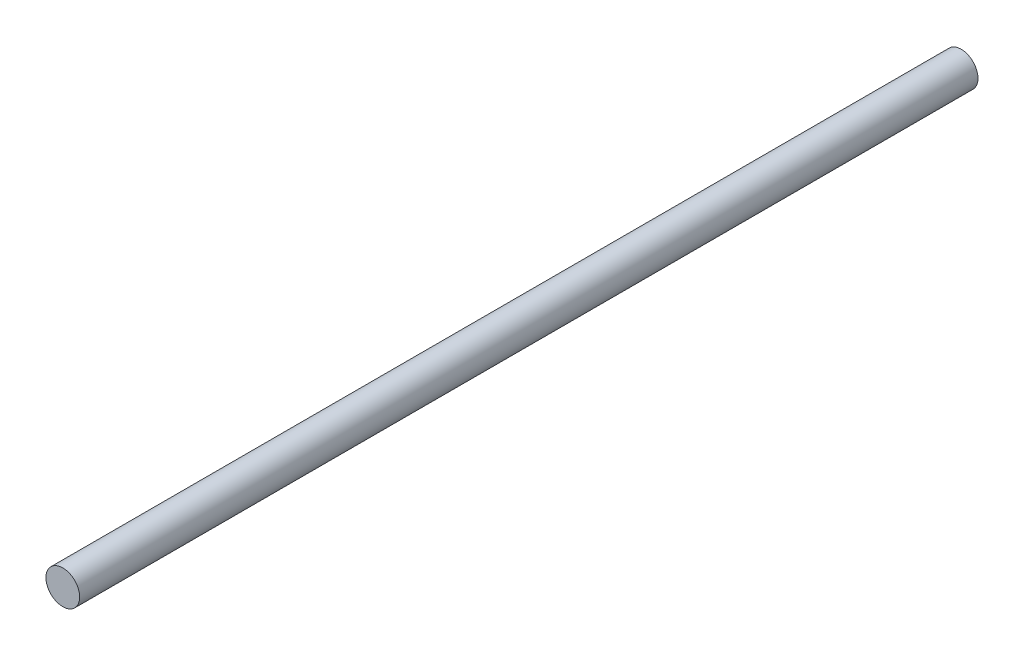
ISO-10303-21;
HEADER;
FILE_DESCRIPTION(('STEP AP214'),'2;1');
FILE_NAME('part.step','',(''),(''),'','','');
FILE_SCHEMA(('AUTOMOTIVE_DESIGN { 1 0 10303 214 1 1 1 1 }'));
ENDSEC;
DATA;
#1=APPLICATION_CONTEXT('core data for automotive mechanical design processes');
#2=APPLICATION_PROTOCOL_DEFINITION('international standard','automotive_design',2000,#1);
#3=PRODUCT_CONTEXT('',#1,'mechanical');
#4=PRODUCT('Part','Part','',(#3));
#5=PRODUCT_RELATED_PRODUCT_CATEGORY('part','',(#4));
#6=PRODUCT_DEFINITION_FORMATION('','',#4);
#7=PRODUCT_DEFINITION_CONTEXT('part definition',#1,'design');
#8=PRODUCT_DEFINITION('design','',#6,#7);
#9=PRODUCT_DEFINITION_SHAPE('','',#8);
#10=(LENGTH_UNIT() NAMED_UNIT(*) SI_UNIT(.MILLI.,.METRE.));
#11=(NAMED_UNIT(*) PLANE_ANGLE_UNIT() SI_UNIT($,.RADIAN.));
#12=(NAMED_UNIT(*) SI_UNIT($,.STERADIAN.) SOLID_ANGLE_UNIT());
#13=UNCERTAINTY_MEASURE_WITH_UNIT(LENGTH_MEASURE(1.E-05),#10,'distance_accuracy_value','');
#14=(GEOMETRIC_REPRESENTATION_CONTEXT(3) GLOBAL_UNCERTAINTY_ASSIGNED_CONTEXT((#13)) GLOBAL_UNIT_ASSIGNED_CONTEXT((#10,
#11,#12)) REPRESENTATION_CONTEXT('',''));
#15=CARTESIAN_POINT('',(0.,0.,0.));
#16=DIRECTION('',(0.,0.,1.));
#17=DIRECTION('',(1.,0.,0.));
#18=AXIS2_PLACEMENT_3D('',#15,#16,#17);
#19=CARTESIAN_POINT('',(0.,0.,400.));
#20=DIRECTION('',(0.,0.,-1.));
#21=DIRECTION('',(-1.,0.,0.));
#22=AXIS2_PLACEMENT_3D('',#19,#20,#21);
#23=CYLINDRICAL_SURFACE('',#22,7.50000000000001);
#24=CARTESIAN_POINT('',(0.,0.,400.));
#25=DIRECTION('',(0.,0.,1.));
#26=DIRECTION('',(1.,0.,0.));
#27=AXIS2_PLACEMENT_3D('',#24,#25,#26);
#28=CIRCLE('',#27,7.50000000000001);
#29=CARTESIAN_POINT('',(7.50000000000001,0.,400.));
#30=VERTEX_POINT('',#29);
#31=EDGE_CURVE('E10',#30,#30,#28,.T.);
#32=ORIENTED_EDGE('',*,*,#31,.F.);
#33=EDGE_LOOP('',(#32));
#34=FACE_BOUND('',#33,.T.);
#35=CARTESIAN_POINT('',(0.,0.,0.));
#36=DIRECTION('',(0.,0.,1.));
#37=DIRECTION('',(1.,0.,0.));
#38=AXIS2_PLACEMENT_3D('',#35,#36,#37);
#39=CIRCLE('',#38,7.50000000000001);
#40=CARTESIAN_POINT('',(7.50000000000001,0.,0.));
#41=VERTEX_POINT('',#40);
#42=EDGE_CURVE('E34',#41,#41,#39,.T.);
#43=ORIENTED_EDGE('',*,*,#42,.T.);
#44=EDGE_LOOP('',(#43));
#45=FACE_BOUND('',#44,.T.);
#46=ADVANCED_FACE('F31',(#34,#45),#23,.T.);
#47=CARTESIAN_POINT('',(0.,0.,400.));
#48=DIRECTION('',(0.,0.,1.));
#49=DIRECTION('',(1.,0.,0.));
#50=AXIS2_PLACEMENT_3D('',#47,#48,#49);
#51=PLANE('',#50);
#52=ORIENTED_EDGE('',*,*,#31,.T.);
#53=EDGE_LOOP('',(#52));
#54=FACE_BOUND('',#53,.T.);
#55=ADVANCED_FACE('F46',(#54),#51,.T.);
#56=CARTESIAN_POINT('',(0.,0.,0.));
#57=DIRECTION('',(0.,0.,1.));
#58=DIRECTION('',(1.,0.,0.));
#59=AXIS2_PLACEMENT_3D('',#56,#57,#58);
#60=PLANE('',#59);
#61=ORIENTED_EDGE('',*,*,#42,.F.);
#62=EDGE_LOOP('',(#61));
#63=FACE_BOUND('',#62,.T.);
#64=ADVANCED_FACE('F44',(#63),#60,.F.);
#65=CLOSED_SHELL('',(#46,#55,#64));
#66=MANIFOLD_SOLID_BREP('B2',#65);
#67=ADVANCED_BREP_SHAPE_REPRESENTATION('',(#18,#66),#14);
#68=SHAPE_DEFINITION_REPRESENTATION(#9,#67);
ENDSEC;
END-ISO-10303-21;
